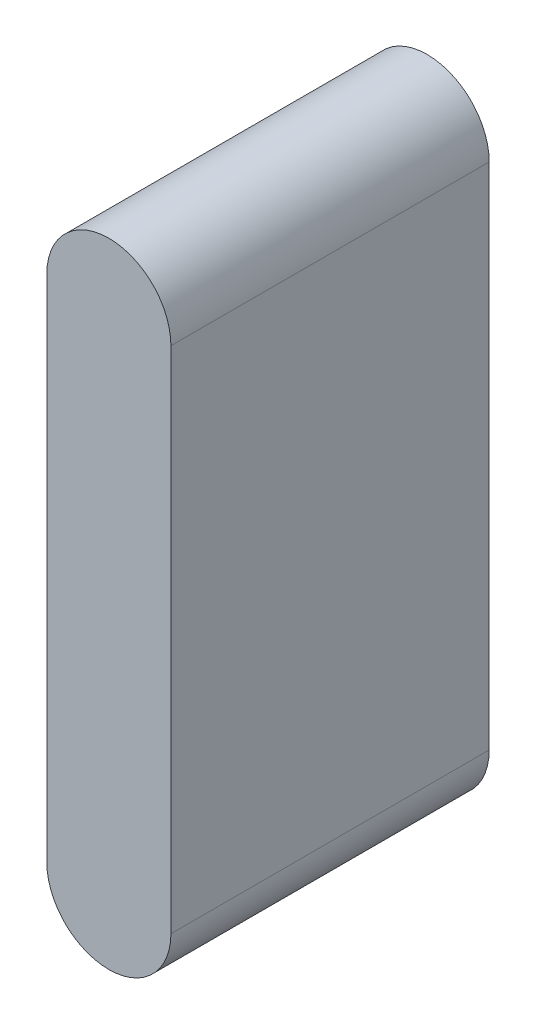
ISO-10303-21;
HEADER;
FILE_DESCRIPTION(('STEP AP214'),'2;1');
FILE_NAME('part.step','',(''),(''),'','','');
FILE_SCHEMA(('AUTOMOTIVE_DESIGN { 1 0 10303 214 1 1 1 1 }'));
ENDSEC;
DATA;
#1=APPLICATION_CONTEXT('core data for automotive mechanical design processes');
#2=APPLICATION_PROTOCOL_DEFINITION('international standard','automotive_design',2000,#1);
#3=PRODUCT_CONTEXT('',#1,'mechanical');
#4=PRODUCT('Part','Part','',(#3));
#5=PRODUCT_RELATED_PRODUCT_CATEGORY('part','',(#4));
#6=PRODUCT_DEFINITION_FORMATION('','',#4);
#7=PRODUCT_DEFINITION_CONTEXT('part definition',#1,'design');
#8=PRODUCT_DEFINITION('design','',#6,#7);
#9=PRODUCT_DEFINITION_SHAPE('','',#8);
#10=(LENGTH_UNIT() NAMED_UNIT(*) SI_UNIT(.MILLI.,.METRE.));
#11=(NAMED_UNIT(*) PLANE_ANGLE_UNIT() SI_UNIT($,.RADIAN.));
#12=(NAMED_UNIT(*) SI_UNIT($,.STERADIAN.) SOLID_ANGLE_UNIT());
#13=UNCERTAINTY_MEASURE_WITH_UNIT(LENGTH_MEASURE(1.E-05),#10,'distance_accuracy_value','');
#14=(GEOMETRIC_REPRESENTATION_CONTEXT(3) GLOBAL_UNCERTAINTY_ASSIGNED_CONTEXT((#13)) GLOBAL_UNIT_ASSIGNED_CONTEXT((#10,
#11,#12)) REPRESENTATION_CONTEXT('',''));
#15=CARTESIAN_POINT('',(0.,0.,0.));
#16=DIRECTION('',(0.,0.,1.));
#17=DIRECTION('',(1.,0.,0.));
#18=AXIS2_PLACEMENT_3D('',#15,#16,#17);
#19=CARTESIAN_POINT('',(0.,9.54107142857143,10.));
#20=DIRECTION('',(0.,0.,-1.));
#21=DIRECTION('',(-1.,0.,0.));
#22=AXIS2_PLACEMENT_3D('',#19,#20,#21);
#23=CYLINDRICAL_SURFACE('',#22,1.95);
#24=CARTESIAN_POINT('',(0.,9.54107142857143,0.));
#25=DIRECTION('',(0.,0.,1.));
#26=DIRECTION('',(1.,0.,0.));
#27=AXIS2_PLACEMENT_3D('',#24,#25,#26);
#28=CIRCLE('',#27,1.95);
#29=CARTESIAN_POINT('',(1.95,9.54107142857143,0.));
#30=VERTEX_POINT('',#29);
#31=CARTESIAN_POINT('',(-1.95,9.54107142857143,0.));
#32=VERTEX_POINT('',#31);
#33=EDGE_CURVE('E103',#30,#32,#28,.T.);
#34=ORIENTED_EDGE('',*,*,#33,.T.);
#35=DIRECTION('',(0.,0.,-1.));
#36=VECTOR('',#35,1.);
#37=CARTESIAN_POINT('',(-1.95,9.54107142857143,10.));
#38=LINE('',#37,#36);
#39=CARTESIAN_POINT('',(-1.95,9.54107142857143,10.));
#40=VERTEX_POINT('',#39);
#41=EDGE_CURVE('E11',#40,#32,#38,.T.);
#42=ORIENTED_EDGE('',*,*,#41,.F.);
#43=CARTESIAN_POINT('',(0.,9.54107142857143,10.));
#44=DIRECTION('',(0.,0.,1.));
#45=DIRECTION('',(1.,0.,0.));
#46=AXIS2_PLACEMENT_3D('',#43,#44,#45);
#47=CIRCLE('',#46,1.95);
#48=CARTESIAN_POINT('',(1.95,9.54107142857143,10.));
#49=VERTEX_POINT('',#48);
#50=EDGE_CURVE('E91',#49,#40,#47,.T.);
#51=ORIENTED_EDGE('',*,*,#50,.F.);
#52=DIRECTION('',(0.,0.,-1.));
#53=VECTOR('',#52,1.);
#54=CARTESIAN_POINT('',(1.95,9.54107142857143,10.));
#55=LINE('',#54,#53);
#56=EDGE_CURVE('E99',#49,#30,#55,.T.);
#57=ORIENTED_EDGE('',*,*,#56,.T.);
#58=EDGE_LOOP('',(#34,#42,#51,#57));
#59=FACE_BOUND('',#58,.T.);
#60=ADVANCED_FACE('F40',(#59),#23,.T.);
#61=CARTESIAN_POINT('',(-1.95,9.54107142857143,10.));
#62=DIRECTION('',(1.,0.,0.));
#63=DIRECTION('',(0.,1.,0.));
#64=AXIS2_PLACEMENT_3D('',#61,#62,#63);
#65=PLANE('',#64);
#66=DIRECTION('',(0.,-1.,0.));
#67=VECTOR('',#66,1.);
#68=CARTESIAN_POINT('',(-1.95,9.54107142857143,0.));
#69=LINE('',#68,#67);
#70=CARTESIAN_POINT('',(-1.95,-6.45892857142857,0.));
#71=VERTEX_POINT('',#70);
#72=EDGE_CURVE('E95',#32,#71,#69,.T.);
#73=ORIENTED_EDGE('',*,*,#72,.T.);
#74=DIRECTION('',(0.,0.,-1.));
#75=VECTOR('',#74,1.);
#76=CARTESIAN_POINT('',(-1.95,-6.45892857142857,10.));
#77=LINE('',#76,#75);
#78=CARTESIAN_POINT('',(-1.95,-6.45892857142857,10.));
#79=VERTEX_POINT('',#78);
#80=EDGE_CURVE('E48',#79,#71,#77,.T.);
#81=ORIENTED_EDGE('',*,*,#80,.F.);
#82=DIRECTION('',(0.,-1.,0.));
#83=VECTOR('',#82,1.);
#84=CARTESIAN_POINT('',(-1.95,9.54107142857143,10.));
#85=LINE('',#84,#83);
#86=EDGE_CURVE('E86',#40,#79,#85,.T.);
#87=ORIENTED_EDGE('',*,*,#86,.F.);
#88=ORIENTED_EDGE('',*,*,#41,.T.);
#89=EDGE_LOOP('',(#73,#81,#87,#88));
#90=FACE_BOUND('',#89,.T.);
#91=ADVANCED_FACE('F94',(#90),#65,.F.);
#92=CARTESIAN_POINT('',(0.,-6.45892857142857,10.));
#93=DIRECTION('',(0.,0.,-1.));
#94=DIRECTION('',(-1.,0.,0.));
#95=AXIS2_PLACEMENT_3D('',#92,#93,#94);
#96=CYLINDRICAL_SURFACE('',#95,1.95);
#97=CARTESIAN_POINT('',(0.,-6.45892857142857,0.));
#98=DIRECTION('',(0.,0.,1.));
#99=DIRECTION('',(1.,0.,0.));
#100=AXIS2_PLACEMENT_3D('',#97,#98,#99);
#101=CIRCLE('',#100,1.95);
#102=CARTESIAN_POINT('',(1.95,-6.45892857142857,0.));
#103=VERTEX_POINT('',#102);
#104=EDGE_CURVE('E73',#71,#103,#101,.T.);
#105=ORIENTED_EDGE('',*,*,#104,.T.);
#106=DIRECTION('',(0.,0.,-1.));
#107=VECTOR('',#106,1.);
#108=CARTESIAN_POINT('',(1.95,-6.45892857142857,10.));
#109=LINE('',#108,#107);
#110=CARTESIAN_POINT('',(1.95,-6.45892857142857,10.));
#111=VERTEX_POINT('',#110);
#112=EDGE_CURVE('E96',#111,#103,#109,.T.);
#113=ORIENTED_EDGE('',*,*,#112,.F.);
#114=CARTESIAN_POINT('',(0.,-6.45892857142857,10.));
#115=DIRECTION('',(0.,0.,1.));
#116=DIRECTION('',(1.,0.,0.));
#117=AXIS2_PLACEMENT_3D('',#114,#115,#116);
#118=CIRCLE('',#117,1.95);
#119=EDGE_CURVE('E89',#79,#111,#118,.T.);
#120=ORIENTED_EDGE('',*,*,#119,.F.);
#121=ORIENTED_EDGE('',*,*,#80,.T.);
#122=EDGE_LOOP('',(#105,#113,#120,#121));
#123=FACE_BOUND('',#122,.T.);
#124=ADVANCED_FACE('F97',(#123),#96,.T.);
#125=CARTESIAN_POINT('',(1.95,9.54107142857143,10.));
#126=DIRECTION('',(-1.,0.,0.));
#127=DIRECTION('',(0.,-1.,0.));
#128=AXIS2_PLACEMENT_3D('',#125,#126,#127);
#129=PLANE('',#128);
#130=DIRECTION('',(0.,1.,0.));
#131=VECTOR('',#130,1.);
#132=CARTESIAN_POINT('',(1.95,9.54107142857143,0.));
#133=LINE('',#132,#131);
#134=EDGE_CURVE('E79',#103,#30,#133,.T.);
#135=ORIENTED_EDGE('',*,*,#134,.T.);
#136=ORIENTED_EDGE('',*,*,#56,.F.);
#137=DIRECTION('',(0.,1.,0.));
#138=VECTOR('',#137,1.);
#139=CARTESIAN_POINT('',(1.95,9.54107142857143,10.));
#140=LINE('',#139,#138);
#141=EDGE_CURVE('E56',#111,#49,#140,.T.);
#142=ORIENTED_EDGE('',*,*,#141,.F.);
#143=ORIENTED_EDGE('',*,*,#112,.T.);
#144=EDGE_LOOP('',(#135,#136,#142,#143));
#145=FACE_BOUND('',#144,.T.);
#146=ADVANCED_FACE('F110',(#145),#129,.F.);
#147=CARTESIAN_POINT('',(0.,9.54107142857143,10.));
#148=DIRECTION('',(0.,0.,1.));
#149=DIRECTION('',(1.,0.,0.));
#150=AXIS2_PLACEMENT_3D('',#147,#148,#149);
#151=PLANE('',#150);
#152=ORIENTED_EDGE('',*,*,#50,.T.);
#153=ORIENTED_EDGE('',*,*,#86,.T.);
#154=ORIENTED_EDGE('',*,*,#119,.T.);
#155=ORIENTED_EDGE('',*,*,#141,.T.);
#156=EDGE_LOOP('',(#152,#153,#154,#155));
#157=FACE_BOUND('',#156,.T.);
#158=ADVANCED_FACE('F87',(#157),#151,.T.);
#159=CARTESIAN_POINT('',(0.,9.54107142857143,0.));
#160=DIRECTION('',(0.,0.,1.));
#161=DIRECTION('',(1.,0.,0.));
#162=AXIS2_PLACEMENT_3D('',#159,#160,#161);
#163=PLANE('',#162);
#164=ORIENTED_EDGE('',*,*,#33,.F.);
#165=ORIENTED_EDGE('',*,*,#134,.F.);
#166=ORIENTED_EDGE('',*,*,#104,.F.);
#167=ORIENTED_EDGE('',*,*,#72,.F.);
#168=EDGE_LOOP('',(#164,#165,#166,#167));
#169=FACE_BOUND('',#168,.T.);
#170=ADVANCED_FACE('F113',(#169),#163,.F.);
#171=CLOSED_SHELL('',(#60,#91,#124,#146,#158,#170));
#172=MANIFOLD_SOLID_BREP('B2',#171);
#173=ADVANCED_BREP_SHAPE_REPRESENTATION('',(#18,#172),#14);
#174=SHAPE_DEFINITION_REPRESENTATION(#9,#173);
ENDSEC;
END-ISO-10303-21;
